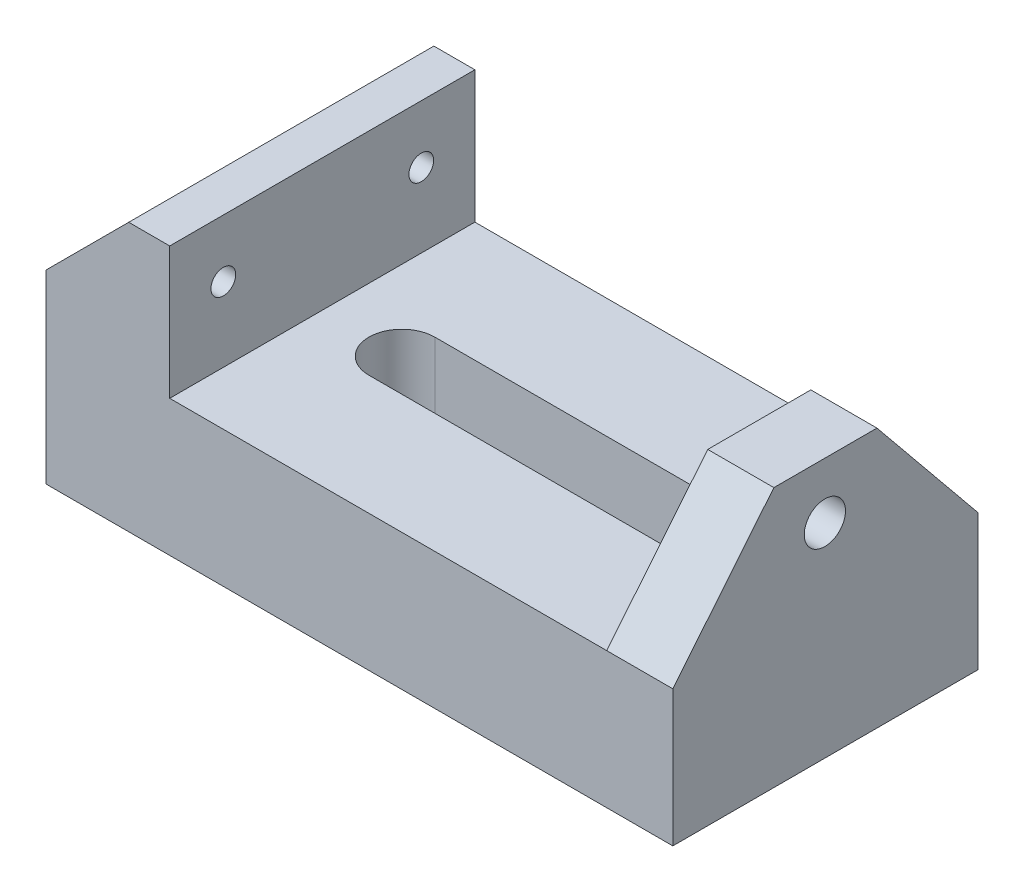
ISO-10303-21;
HEADER;
FILE_DESCRIPTION(('STEP AP214'),'2;1');
FILE_NAME('part.step','',(''),(''),'','','');
FILE_SCHEMA(('AUTOMOTIVE_DESIGN { 1 0 10303 214 1 1 1 1 }'));
ENDSEC;
DATA;
#1=APPLICATION_CONTEXT('core data for automotive mechanical design processes');
#2=APPLICATION_PROTOCOL_DEFINITION('international standard','automotive_design',2000,#1);
#3=PRODUCT_CONTEXT('',#1,'mechanical');
#4=PRODUCT('Part','Part','',(#3));
#5=PRODUCT_RELATED_PRODUCT_CATEGORY('part','',(#4));
#6=PRODUCT_DEFINITION_FORMATION('','',#4);
#7=PRODUCT_DEFINITION_CONTEXT('part definition',#1,'design');
#8=PRODUCT_DEFINITION('design','',#6,#7);
#9=PRODUCT_DEFINITION_SHAPE('','',#8);
#10=(LENGTH_UNIT() NAMED_UNIT(*) SI_UNIT(.MILLI.,.METRE.));
#11=(NAMED_UNIT(*) PLANE_ANGLE_UNIT() SI_UNIT($,.RADIAN.));
#12=(NAMED_UNIT(*) SI_UNIT($,.STERADIAN.) SOLID_ANGLE_UNIT());
#13=UNCERTAINTY_MEASURE_WITH_UNIT(LENGTH_MEASURE(1.E-05),#10,'distance_accuracy_value','');
#14=(GEOMETRIC_REPRESENTATION_CONTEXT(3) GLOBAL_UNCERTAINTY_ASSIGNED_CONTEXT((#13)) GLOBAL_UNIT_ASSIGNED_CONTEXT((#10,
#11,#12)) REPRESENTATION_CONTEXT('',''));
#15=CARTESIAN_POINT('',(0.,0.,0.));
#16=DIRECTION('',(0.,0.,1.));
#17=DIRECTION('',(1.,0.,0.));
#18=AXIS2_PLACEMENT_3D('',#15,#16,#17);
#19=CARTESIAN_POINT('',(-105.963302752294,0.,74.));
#20=DIRECTION('',(0.,-1.,0.));
#21=DIRECTION('',(0.,0.,-1.));
#22=AXIS2_PLACEMENT_3D('',#19,#20,#21);
#23=PLANE('',#22);
#24=DIRECTION('',(1.,0.,0.));
#25=VECTOR('',#24,1.);
#26=CARTESIAN_POINT('',(-86.6730770801467,0.,45.));
#27=LINE('',#26,#25);
#28=CARTESIAN_POINT('',(-86.6730770801467,0.,45.));
#29=VERTEX_POINT('',#28);
#30=CARTESIAN_POINT('',(-8.67307708014674,0.,45.));
#31=VERTEX_POINT('',#30);
#32=EDGE_CURVE('E277',#29,#31,#27,.T.);
#33=ORIENTED_EDGE('',*,*,#32,.F.);
#34=CARTESIAN_POINT('',(-86.6730770801467,0.,37.));
#35=DIRECTION('',(0.,1.,0.));
#36=DIRECTION('',(0.,0.,1.));
#37=AXIS2_PLACEMENT_3D('',#34,#35,#36);
#38=CIRCLE('',#37,8.);
#39=CARTESIAN_POINT('',(-86.6730770801467,0.,29.));
#40=VERTEX_POINT('',#39);
#41=EDGE_CURVE('E58',#40,#29,#38,.T.);
#42=ORIENTED_EDGE('',*,*,#41,.F.);
#43=DIRECTION('',(-1.,0.,0.));
#44=VECTOR('',#43,1.);
#45=CARTESIAN_POINT('',(-86.6730770801467,0.,29.));
#46=LINE('',#45,#44);
#47=CARTESIAN_POINT('',(-8.67307708014674,0.,29.));
#48=VERTEX_POINT('',#47);
#49=EDGE_CURVE('E267',#48,#40,#46,.T.);
#50=ORIENTED_EDGE('',*,*,#49,.F.);
#51=CARTESIAN_POINT('',(-8.67307708014674,0.,37.));
#52=DIRECTION('',(0.,1.,0.));
#53=DIRECTION('',(0.,0.,1.));
#54=AXIS2_PLACEMENT_3D('',#51,#52,#53);
#55=CIRCLE('',#54,8.);
#56=EDGE_CURVE('E274',#31,#48,#55,.T.);
#57=ORIENTED_EDGE('',*,*,#56,.F.);
#58=EDGE_LOOP('',(#33,#42,#50,#57));
#59=FACE_BOUND('',#58,.T.);
#60=DIRECTION('',(-1.,0.,0.));
#61=VECTOR('',#60,1.);
#62=CARTESIAN_POINT('',(-105.963302752294,0.,0.));
#63=LINE('',#62,#61);
#64=CARTESIAN_POINT('',(0.,0.,0.));
#65=VERTEX_POINT('',#64);
#66=CARTESIAN_POINT('',(-105.963302752294,0.,0.));
#67=VERTEX_POINT('',#66);
#68=EDGE_CURVE('E168',#65,#67,#63,.T.);
#69=ORIENTED_EDGE('',*,*,#68,.T.);
#70=DIRECTION('',(0.,0.,-1.));
#71=VECTOR('',#70,1.);
#72=CARTESIAN_POINT('',(-105.963302752294,0.,74.));
#73=LINE('',#72,#71);
#74=CARTESIAN_POINT('',(-105.963302752294,0.,74.));
#75=VERTEX_POINT('',#74);
#76=EDGE_CURVE('E196',#75,#67,#73,.T.);
#77=ORIENTED_EDGE('',*,*,#76,.F.);
#78=DIRECTION('',(-1.,0.,0.));
#79=VECTOR('',#78,1.);
#80=CARTESIAN_POINT('',(-105.963302752294,0.,74.));
#81=LINE('',#80,#79);
#82=CARTESIAN_POINT('',(0.,0.,74.));
#83=VERTEX_POINT('',#82);
#84=EDGE_CURVE('E183',#83,#75,#81,.T.);
#85=ORIENTED_EDGE('',*,*,#84,.F.);
#86=DIRECTION('',(0.,0.,-1.));
#87=VECTOR('',#86,1.);
#88=CARTESIAN_POINT('',(0.,0.,74.));
#89=LINE('',#88,#87);
#90=EDGE_CURVE('E159',#83,#65,#89,.T.);
#91=ORIENTED_EDGE('',*,*,#90,.T.);
#92=EDGE_LOOP('',(#69,#77,#85,#91));
#93=FACE_BOUND('',#92,.T.);
#94=ADVANCED_FACE('F35',(#59,#93),#23,.F.);
#95=CARTESIAN_POINT('',(-105.963302752294,32.,74.));
#96=DIRECTION('',(-1.,0.,0.));
#97=DIRECTION('',(0.,0.,1.));
#98=AXIS2_PLACEMENT_3D('',#95,#96,#97);
#99=PLANE('',#98);
#100=CARTESIAN_POINT('',(-105.963302752294,18.,61.));
#101=DIRECTION('',(1.,0.,0.));
#102=DIRECTION('',(0.,0.,-1.));
#103=AXIS2_PLACEMENT_3D('',#100,#101,#102);
#104=CIRCLE('',#103,3.);
#105=CARTESIAN_POINT('',(-105.963302752294,18.,58.));
#106=VERTEX_POINT('',#105);
#107=EDGE_CURVE('E204',#106,#106,#104,.T.);
#108=ORIENTED_EDGE('',*,*,#107,.F.);
#109=EDGE_LOOP('',(#108));
#110=FACE_BOUND('',#109,.T.);
#111=CARTESIAN_POINT('',(-105.963302752294,18.,13.));
#112=DIRECTION('',(1.,0.,0.));
#113=DIRECTION('',(0.,0.,-1.));
#114=AXIS2_PLACEMENT_3D('',#111,#112,#113);
#115=CIRCLE('',#114,3.);
#116=CARTESIAN_POINT('',(-105.963302752294,18.,10.));
#117=VERTEX_POINT('',#116);
#118=EDGE_CURVE('E252',#117,#117,#115,.T.);
#119=ORIENTED_EDGE('',*,*,#118,.F.);
#120=EDGE_LOOP('',(#119));
#121=FACE_BOUND('',#120,.T.);
#122=DIRECTION('',(0.,1.,0.));
#123=VECTOR('',#122,1.);
#124=CARTESIAN_POINT('',(-105.963302752294,32.,0.));
#125=LINE('',#124,#123);
#126=CARTESIAN_POINT('',(-105.963302752294,32.,0.));
#127=VERTEX_POINT('',#126);
#128=EDGE_CURVE('E170',#67,#127,#125,.T.);
#129=ORIENTED_EDGE('',*,*,#128,.T.);
#130=DIRECTION('',(0.,0.,-1.));
#131=VECTOR('',#130,1.);
#132=CARTESIAN_POINT('',(-105.963302752294,32.,74.));
#133=LINE('',#132,#131);
#134=CARTESIAN_POINT('',(-105.963302752294,32.,74.));
#135=VERTEX_POINT('',#134);
#136=EDGE_CURVE('E193',#135,#127,#133,.T.);
#137=ORIENTED_EDGE('',*,*,#136,.F.);
#138=DIRECTION('',(0.,1.,0.));
#139=VECTOR('',#138,1.);
#140=CARTESIAN_POINT('',(-105.963302752294,32.,74.));
#141=LINE('',#140,#139);
#142=EDGE_CURVE('E246',#75,#135,#141,.T.);
#143=ORIENTED_EDGE('',*,*,#142,.F.);
#144=ORIENTED_EDGE('',*,*,#76,.T.);
#145=EDGE_LOOP('',(#129,#137,#143,#144));
#146=FACE_BOUND('',#145,.T.);
#147=ADVANCED_FACE('F306',(#110,#121,#146),#99,.F.);
#148=CARTESIAN_POINT('',(-135.963302752294,32.,74.));
#149=DIRECTION('',(0.,-1.,0.));
#150=DIRECTION('',(0.,0.,-1.));
#151=AXIS2_PLACEMENT_3D('',#148,#149,#150);
#152=PLANE('',#151);
#153=DIRECTION('',(-1.,0.,0.));
#154=VECTOR('',#153,1.);
#155=CARTESIAN_POINT('',(-135.963302752294,32.,0.));
#156=LINE('',#155,#154);
#157=CARTESIAN_POINT('',(-115.906958265942,32.,0.));
#158=VERTEX_POINT('',#157);
#159=EDGE_CURVE('E174',#127,#158,#156,.T.);
#160=ORIENTED_EDGE('',*,*,#159,.T.);
#161=DIRECTION('',(0.,0.,1.));
#162=VECTOR('',#161,1.);
#163=CARTESIAN_POINT('',(-115.906958265942,32.,0.));
#164=LINE('',#163,#162);
#165=CARTESIAN_POINT('',(-115.906958265942,32.,74.));
#166=VERTEX_POINT('',#165);
#167=EDGE_CURVE('E238',#158,#166,#164,.T.);
#168=ORIENTED_EDGE('',*,*,#167,.T.);
#169=DIRECTION('',(-1.,0.,0.));
#170=VECTOR('',#169,1.);
#171=CARTESIAN_POINT('',(-115.963302752294,32.,74.));
#172=LINE('',#171,#170);
#173=EDGE_CURVE('E248',#135,#166,#172,.T.);
#174=ORIENTED_EDGE('',*,*,#173,.F.);
#175=ORIENTED_EDGE('',*,*,#136,.T.);
#176=EDGE_LOOP('',(#160,#168,#174,#175));
#177=FACE_BOUND('',#176,.T.);
#178=ADVANCED_FACE('F311',(#177),#152,.F.);
#179=CARTESIAN_POINT('',(-135.963302752294,-33.,74.));
#180=DIRECTION('',(1.,0.,0.));
#181=DIRECTION('',(0.,0.,-1.));
#182=AXIS2_PLACEMENT_3D('',#179,#180,#181);
#183=PLANE('',#182);
#184=CARTESIAN_POINT('',(-135.963302752294,-4.8642563903627,36.610721791007));
#185=DIRECTION('',(-1.,0.,0.));
#186=DIRECTION('',(0.,0.,1.));
#187=AXIS2_PLACEMENT_3D('',#184,#185,#186);
#188=CIRCLE('',#187,8.);
#189=CARTESIAN_POINT('',(-135.963302752294,-4.8642563903627,44.610721791007));
#190=VERTEX_POINT('',#189);
#191=EDGE_CURVE('E258',#190,#190,#188,.T.);
#192=ORIENTED_EDGE('',*,*,#191,.F.);
#193=EDGE_LOOP('',(#192));
#194=FACE_BOUND('',#193,.T.);
#195=DIRECTION('',(0.,-1.,0.));
#196=VECTOR('',#195,1.);
#197=CARTESIAN_POINT('',(-135.963302752294,18.,74.));
#198=LINE('',#197,#196);
#199=CARTESIAN_POINT('',(-135.963302752294,11.9436555136481,74.));
#200=VERTEX_POINT('',#199);
#201=CARTESIAN_POINT('',(-135.963302752294,-33.,74.));
#202=VERTEX_POINT('',#201);
#203=EDGE_CURVE('E164',#200,#202,#198,.T.);
#204=ORIENTED_EDGE('',*,*,#203,.F.);
#205=DIRECTION('',(0.,0.,1.));
#206=VECTOR('',#205,1.);
#207=CARTESIAN_POINT('',(-135.963302752294,11.9436555136481,0.));
#208=LINE('',#207,#206);
#209=CARTESIAN_POINT('',(-135.963302752294,11.9436555136481,0.));
#210=VERTEX_POINT('',#209);
#211=EDGE_CURVE('E171',#210,#200,#208,.T.);
#212=ORIENTED_EDGE('',*,*,#211,.F.);
#213=DIRECTION('',(0.,-1.,0.));
#214=VECTOR('',#213,1.);
#215=CARTESIAN_POINT('',(-135.963302752294,-33.,0.));
#216=LINE('',#215,#214);
#217=CARTESIAN_POINT('',(-135.963302752294,-33.,0.));
#218=VERTEX_POINT('',#217);
#219=EDGE_CURVE('E177',#210,#218,#216,.T.);
#220=ORIENTED_EDGE('',*,*,#219,.T.);
#221=DIRECTION('',(0.,0.,-1.));
#222=VECTOR('',#221,1.);
#223=CARTESIAN_POINT('',(-135.963302752294,-33.,74.));
#224=LINE('',#223,#222);
#225=EDGE_CURVE('E190',#202,#218,#224,.T.);
#226=ORIENTED_EDGE('',*,*,#225,.F.);
#227=EDGE_LOOP('',(#204,#212,#220,#226));
#228=FACE_BOUND('',#227,.T.);
#229=ADVANCED_FACE('F235',(#194,#228),#183,.F.);
#230=CARTESIAN_POINT('',(16.0366972477063,-33.,74.));
#231=DIRECTION('',(0.,1.,0.));
#232=DIRECTION('',(-1.,0.,0.));
#233=AXIS2_PLACEMENT_3D('',#230,#231,#232);
#234=PLANE('',#233);
#235=DIRECTION('',(-1.,0.,0.));
#236=VECTOR('',#235,1.);
#237=CARTESIAN_POINT('',(16.0366972477063,-33.,29.));
#238=LINE('',#237,#236);
#239=CARTESIAN_POINT('',(-8.67307708014674,-33.,29.));
#240=VERTEX_POINT('',#239);
#241=CARTESIAN_POINT('',(-86.6730770801467,-33.,29.));
#242=VERTEX_POINT('',#241);
#243=EDGE_CURVE('E213',#240,#242,#238,.T.);
#244=ORIENTED_EDGE('',*,*,#243,.T.);
#245=CARTESIAN_POINT('',(-86.6730770801467,-33.,37.));
#246=DIRECTION('',(0.,1.,0.));
#247=DIRECTION('',(-1.,0.,0.));
#248=AXIS2_PLACEMENT_3D('',#245,#246,#247);
#249=CIRCLE('',#248,8.);
#250=CARTESIAN_POINT('',(-86.6730770801467,-33.,45.));
#251=VERTEX_POINT('',#250);
#252=EDGE_CURVE('E216',#242,#251,#249,.T.);
#253=ORIENTED_EDGE('',*,*,#252,.T.);
#254=DIRECTION('',(1.,0.,0.));
#255=VECTOR('',#254,1.);
#256=CARTESIAN_POINT('',(16.0366972477063,-33.,45.));
#257=LINE('',#256,#255);
#258=CARTESIAN_POINT('',(-8.67307708014674,-33.,45.));
#259=VERTEX_POINT('',#258);
#260=EDGE_CURVE('E199',#251,#259,#257,.T.);
#261=ORIENTED_EDGE('',*,*,#260,.T.);
#262=CARTESIAN_POINT('',(-8.67307708014674,-33.,37.));
#263=DIRECTION('',(0.,1.,0.));
#264=DIRECTION('',(-1.,0.,0.));
#265=AXIS2_PLACEMENT_3D('',#262,#263,#264);
#266=CIRCLE('',#265,8.);
#267=EDGE_CURVE('E210',#259,#240,#266,.T.);
#268=ORIENTED_EDGE('',*,*,#267,.T.);
#269=EDGE_LOOP('',(#244,#253,#261,#268));
#270=FACE_BOUND('',#269,.T.);
#271=DIRECTION('',(1.,0.,0.));
#272=VECTOR('',#271,1.);
#273=CARTESIAN_POINT('',(16.0366972477063,-33.,0.));
#274=LINE('',#273,#272);
#275=CARTESIAN_POINT('',(16.0366972477063,-33.,0.));
#276=VERTEX_POINT('',#275);
#277=EDGE_CURVE('E179',#218,#276,#274,.T.);
#278=ORIENTED_EDGE('',*,*,#277,.T.);
#279=DIRECTION('',(0.,0.,-1.));
#280=VECTOR('',#279,1.);
#281=CARTESIAN_POINT('',(16.0366972477063,-33.,74.));
#282=LINE('',#281,#280);
#283=CARTESIAN_POINT('',(16.0366972477063,-33.,74.));
#284=VERTEX_POINT('',#283);
#285=EDGE_CURVE('E188',#284,#276,#282,.T.);
#286=ORIENTED_EDGE('',*,*,#285,.F.);
#287=DIRECTION('',(1.,0.,0.));
#288=VECTOR('',#287,1.);
#289=CARTESIAN_POINT('',(16.0366972477063,-33.,74.));
#290=LINE('',#289,#288);
#291=EDGE_CURVE('E157',#202,#284,#290,.T.);
#292=ORIENTED_EDGE('',*,*,#291,.F.);
#293=ORIENTED_EDGE('',*,*,#225,.T.);
#294=EDGE_LOOP('',(#278,#286,#292,#293));
#295=FACE_BOUND('',#294,.T.);
#296=ADVANCED_FACE('F227',(#270,#295),#234,.F.);
#297=CARTESIAN_POINT('',(16.0366972477063,30.,74.));
#298=DIRECTION('',(-1.,0.,0.));
#299=DIRECTION('',(0.,-1.,0.));
#300=AXIS2_PLACEMENT_3D('',#297,#298,#299);
#301=PLANE('',#300);
#302=CARTESIAN_POINT('',(16.0366972477063,16.44,37.1355677984919));
#303=DIRECTION('',(1.,0.,0.));
#304=DIRECTION('',(0.,1.,0.));
#305=AXIS2_PLACEMENT_3D('',#302,#303,#304);
#306=CIRCLE('',#305,5.);
#307=CARTESIAN_POINT('',(16.0366972477063,21.44,37.1355677984919));
#308=VERTEX_POINT('',#307);
#309=EDGE_CURVE('E287',#308,#308,#306,.T.);
#310=ORIENTED_EDGE('',*,*,#309,.F.);
#311=EDGE_LOOP('',(#310));
#312=FACE_BOUND('',#311,.T.);
#313=DIRECTION('',(0.,0.,-1.));
#314=VECTOR('',#313,1.);
#315=CARTESIAN_POINT('',(16.0366972477063,30.,74.));
#316=LINE('',#315,#314);
#317=CARTESIAN_POINT('',(16.0366972477063,30.,49.5));
#318=VERTEX_POINT('',#317);
#319=CARTESIAN_POINT('',(16.0366972477063,30.,24.5));
#320=VERTEX_POINT('',#319);
#321=EDGE_CURVE('E151',#318,#320,#316,.T.);
#322=ORIENTED_EDGE('',*,*,#321,.F.);
#323=DIRECTION('',(0.,0.774532127586641,-0.632534570862424));
#324=VECTOR('',#323,1.);
#325=CARTESIAN_POINT('',(16.0366972477063,0.,74.));
#326=LINE('',#325,#324);
#327=CARTESIAN_POINT('',(16.0366972477063,0.,74.));
#328=VERTEX_POINT('',#327);
#329=EDGE_CURVE('E137',#328,#318,#326,.T.);
#330=ORIENTED_EDGE('',*,*,#329,.F.);
#331=DIRECTION('',(0.,1.,0.));
#332=VECTOR('',#331,1.);
#333=CARTESIAN_POINT('',(16.0366972477063,30.,74.));
#334=LINE('',#333,#332);
#335=EDGE_CURVE('E149',#284,#328,#334,.T.);
#336=ORIENTED_EDGE('',*,*,#335,.F.);
#337=ORIENTED_EDGE('',*,*,#285,.T.);
#338=DIRECTION('',(0.,1.,0.));
#339=VECTOR('',#338,1.);
#340=CARTESIAN_POINT('',(16.0366972477063,30.,0.));
#341=LINE('',#340,#339);
#342=CARTESIAN_POINT('',(16.0366972477063,0.,0.));
#343=VERTEX_POINT('',#342);
#344=EDGE_CURVE('E181',#276,#343,#341,.T.);
#345=ORIENTED_EDGE('',*,*,#344,.T.);
#346=DIRECTION('',(0.,-0.774532127586641,-0.632534570862424));
#347=VECTOR('',#346,1.);
#348=CARTESIAN_POINT('',(16.0366972477063,30.,24.5));
#349=LINE('',#348,#347);
#350=EDGE_CURVE('E50',#320,#343,#349,.T.);
#351=ORIENTED_EDGE('',*,*,#350,.F.);
#352=EDGE_LOOP('',(#322,#330,#336,#337,#345,#351));
#353=FACE_BOUND('',#352,.T.);
#354=ADVANCED_FACE('F147',(#312,#353),#301,.F.);
#355=CARTESIAN_POINT('',(0.,30.,74.));
#356=DIRECTION('',(0.,-1.,0.));
#357=DIRECTION('',(0.,0.,-1.));
#358=AXIS2_PLACEMENT_3D('',#355,#356,#357);
#359=PLANE('',#358);
#360=DIRECTION('',(0.,0.,-1.));
#361=VECTOR('',#360,1.);
#362=CARTESIAN_POINT('',(0.,30.,74.));
#363=LINE('',#362,#361);
#364=CARTESIAN_POINT('',(0.,30.,49.5));
#365=VERTEX_POINT('',#364);
#366=CARTESIAN_POINT('',(0.,30.,24.5));
#367=VERTEX_POINT('',#366);
#368=EDGE_CURVE('E162',#365,#367,#363,.T.);
#369=ORIENTED_EDGE('',*,*,#368,.F.);
#370=DIRECTION('',(1.,0.,0.));
#371=VECTOR('',#370,1.);
#372=CARTESIAN_POINT('',(-5.96330275229375,30.,49.5));
#373=LINE('',#372,#371);
#374=EDGE_CURVE('E152',#365,#318,#373,.T.);
#375=ORIENTED_EDGE('',*,*,#374,.T.);
#376=ORIENTED_EDGE('',*,*,#321,.T.);
#377=DIRECTION('',(1.,0.,0.));
#378=VECTOR('',#377,1.);
#379=CARTESIAN_POINT('',(-5.96330275229375,30.,24.5));
#380=LINE('',#379,#378);
#381=EDGE_CURVE('E153',#367,#320,#380,.T.);
#382=ORIENTED_EDGE('',*,*,#381,.F.);
#383=EDGE_LOOP('',(#369,#375,#376,#382));
#384=FACE_BOUND('',#383,.T.);
#385=ADVANCED_FACE('F342',(#384),#359,.F.);
#386=CARTESIAN_POINT('',(0.,0.,74.));
#387=DIRECTION('',(1.,0.,0.));
#388=DIRECTION('',(0.,0.,-1.));
#389=AXIS2_PLACEMENT_3D('',#386,#387,#388);
#390=PLANE('',#389);
#391=CARTESIAN_POINT('',(0.,16.44,37.1355677984919));
#392=DIRECTION('',(1.,0.,0.));
#393=DIRECTION('',(0.,0.,-1.));
#394=AXIS2_PLACEMENT_3D('',#391,#392,#393);
#395=CIRCLE('',#394,5.);
#396=CARTESIAN_POINT('',(0.,16.44,32.1355677984919));
#397=VERTEX_POINT('',#396);
#398=EDGE_CURVE('E38',#397,#397,#395,.T.);
#399=ORIENTED_EDGE('',*,*,#398,.T.);
#400=EDGE_LOOP('',(#399));
#401=FACE_BOUND('',#400,.T.);
#402=ORIENTED_EDGE('',*,*,#90,.F.);
#403=DIRECTION('',(0.,0.774532127586641,-0.632534570862424));
#404=VECTOR('',#403,1.);
#405=CARTESIAN_POINT('',(0.,0.,74.));
#406=LINE('',#405,#404);
#407=EDGE_CURVE('E140',#83,#365,#406,.T.);
#408=ORIENTED_EDGE('',*,*,#407,.T.);
#409=ORIENTED_EDGE('',*,*,#368,.T.);
#410=DIRECTION('',(0.,-0.774532127586641,-0.632534570862424));
#411=VECTOR('',#410,1.);
#412=CARTESIAN_POINT('',(0.,36.253957673721,29.6073987668722));
#413=LINE('',#412,#411);
#414=EDGE_CURVE('E282',#367,#65,#413,.T.);
#415=ORIENTED_EDGE('',*,*,#414,.T.);
#416=EDGE_LOOP('',(#402,#408,#409,#415));
#417=FACE_BOUND('',#416,.T.);
#418=ADVANCED_FACE('F294',(#401,#417),#390,.F.);
#419=CARTESIAN_POINT('',(0.,0.,74.));
#420=DIRECTION('',(0.,0.,1.));
#421=DIRECTION('',(1.,0.,0.));
#422=AXIS2_PLACEMENT_3D('',#419,#420,#421);
#423=PLANE('',#422);
#424=DIRECTION('',(1.,0.,0.));
#425=VECTOR('',#424,1.);
#426=CARTESIAN_POINT('',(0.,0.,74.));
#427=LINE('',#426,#425);
#428=EDGE_CURVE('E11',#83,#328,#427,.T.);
#429=ORIENTED_EDGE('',*,*,#428,.F.);
#430=ORIENTED_EDGE('',*,*,#84,.T.);
#431=ORIENTED_EDGE('',*,*,#142,.T.);
#432=ORIENTED_EDGE('',*,*,#173,.T.);
#433=DIRECTION('',(0.707106781186546,0.707106781186549,0.));
#434=VECTOR('',#433,1.);
#435=CARTESIAN_POINT('',(-115.906958265942,32.,74.));
#436=LINE('',#435,#434);
#437=EDGE_CURVE('E207',#200,#166,#436,.T.);
#438=ORIENTED_EDGE('',*,*,#437,.F.);
#439=ORIENTED_EDGE('',*,*,#203,.T.);
#440=ORIENTED_EDGE('',*,*,#291,.T.);
#441=ORIENTED_EDGE('',*,*,#335,.T.);
#442=EDGE_LOOP('',(#429,#430,#431,#432,#438,#439,#440,#441));
#443=FACE_BOUND('',#442,.T.);
#444=ADVANCED_FACE('F155',(#443),#423,.T.);
#445=CARTESIAN_POINT('',(0.,0.,0.));
#446=DIRECTION('',(0.,0.,1.));
#447=DIRECTION('',(1.,0.,0.));
#448=AXIS2_PLACEMENT_3D('',#445,#446,#447);
#449=PLANE('',#448);
#450=ORIENTED_EDGE('',*,*,#68,.F.);
#451=DIRECTION('',(1.,0.,0.));
#452=VECTOR('',#451,1.);
#453=CARTESIAN_POINT('',(0.,0.,0.));
#454=LINE('',#453,#452);
#455=EDGE_CURVE('E43',#65,#343,#454,.T.);
#456=ORIENTED_EDGE('',*,*,#455,.T.);
#457=ORIENTED_EDGE('',*,*,#344,.F.);
#458=ORIENTED_EDGE('',*,*,#277,.F.);
#459=ORIENTED_EDGE('',*,*,#219,.F.);
#460=DIRECTION('',(0.707106781186546,0.707106781186549,0.));
#461=VECTOR('',#460,1.);
#462=CARTESIAN_POINT('',(-115.906958265942,32.,0.));
#463=LINE('',#462,#461);
#464=EDGE_CURVE('E231',#210,#158,#463,.T.);
#465=ORIENTED_EDGE('',*,*,#464,.T.);
#466=ORIENTED_EDGE('',*,*,#159,.F.);
#467=ORIENTED_EDGE('',*,*,#128,.F.);
#468=EDGE_LOOP('',(#450,#456,#457,#458,#459,#465,#466,#467));
#469=FACE_BOUND('',#468,.T.);
#470=ADVANCED_FACE('F222',(#469),#449,.F.);
#471=CARTESIAN_POINT('',(-115.906958265942,32.,0.));
#472=DIRECTION('',(0.707106781186549,-0.707106781186546,0.));
#473=DIRECTION('',(0.707106781186546,0.707106781186549,0.));
#474=AXIS2_PLACEMENT_3D('',#471,#472,#473);
#475=PLANE('',#474);
#476=CARTESIAN_POINT('',(-129.906958265942,18.,61.));
#477=DIRECTION('',(0.707106781186549,-0.707106781186546,0.));
#478=DIRECTION('',(0.707106781186546,0.707106781186549,0.));
#479=AXIS2_PLACEMENT_3D('',#476,#477,#478);
#480=ELLIPSE('',#479,4.24264068711928,3.);
#481=CARTESIAN_POINT('',(-126.906958265942,21.,61.));
#482=VERTEX_POINT('',#481);
#483=EDGE_CURVE('E203',#482,#482,#480,.T.);
#484=ORIENTED_EDGE('',*,*,#483,.T.);
#485=EDGE_LOOP('',(#484));
#486=FACE_BOUND('',#485,.T.);
#487=CARTESIAN_POINT('',(-129.906958265942,18.,13.));
#488=DIRECTION('',(0.707106781186549,-0.707106781186546,0.));
#489=DIRECTION('',(0.707106781186546,0.707106781186549,0.));
#490=AXIS2_PLACEMENT_3D('',#487,#488,#489);
#491=ELLIPSE('',#490,4.24264068711927,3.);
#492=CARTESIAN_POINT('',(-126.906958265942,21.,13.));
#493=VERTEX_POINT('',#492);
#494=EDGE_CURVE('E200',#493,#493,#491,.T.);
#495=ORIENTED_EDGE('',*,*,#494,.T.);
#496=EDGE_LOOP('',(#495));
#497=FACE_BOUND('',#496,.T.);
#498=ORIENTED_EDGE('',*,*,#437,.T.);
#499=ORIENTED_EDGE('',*,*,#167,.F.);
#500=ORIENTED_EDGE('',*,*,#464,.F.);
#501=ORIENTED_EDGE('',*,*,#211,.T.);
#502=EDGE_LOOP('',(#498,#499,#500,#501));
#503=FACE_BOUND('',#502,.T.);
#504=ADVANCED_FACE('F322',(#486,#497,#503),#475,.F.);
#505=CARTESIAN_POINT('',(-179.963302752294,18.,13.));
#506=DIRECTION('',(1.,0.,0.));
#507=DIRECTION('',(0.,0.,-1.));
#508=AXIS2_PLACEMENT_3D('',#505,#506,#507);
#509=CYLINDRICAL_SURFACE('',#508,3.);
#510=ORIENTED_EDGE('',*,*,#118,.T.);
#511=EDGE_LOOP('',(#510));
#512=FACE_BOUND('',#511,.T.);
#513=ORIENTED_EDGE('',*,*,#494,.F.);
#514=EDGE_LOOP('',(#513));
#515=FACE_BOUND('',#514,.T.);
#516=ADVANCED_FACE('F324',(#512,#515),#509,.F.);
#517=CARTESIAN_POINT('',(-179.963302752294,18.,61.));
#518=DIRECTION('',(1.,0.,0.));
#519=DIRECTION('',(0.,0.,-1.));
#520=AXIS2_PLACEMENT_3D('',#517,#518,#519);
#521=CYLINDRICAL_SURFACE('',#520,3.);
#522=ORIENTED_EDGE('',*,*,#107,.T.);
#523=EDGE_LOOP('',(#522));
#524=FACE_BOUND('',#523,.T.);
#525=ORIENTED_EDGE('',*,*,#483,.F.);
#526=EDGE_LOOP('',(#525));
#527=FACE_BOUND('',#526,.T.);
#528=ADVANCED_FACE('F331',(#524,#527),#521,.F.);
#529=CARTESIAN_POINT('',(-122.963302752294,-4.8642563903627,36.610721791007));
#530=DIRECTION('',(-1.,0.,0.));
#531=DIRECTION('',(0.,0.,1.));
#532=AXIS2_PLACEMENT_3D('',#529,#530,#531);
#533=CYLINDRICAL_SURFACE('',#532,8.);
#534=CARTESIAN_POINT('',(-122.963302752294,-4.8642563903627,36.610721791007));
#535=DIRECTION('',(-1.,0.,0.));
#536=DIRECTION('',(0.,0.,1.));
#537=AXIS2_PLACEMENT_3D('',#534,#535,#536);
#538=CIRCLE('',#537,8.);
#539=CARTESIAN_POINT('',(-122.963302752294,-4.8642563903627,44.610721791007));
#540=VERTEX_POINT('',#539);
#541=EDGE_CURVE('E255',#540,#540,#538,.T.);
#542=CARTESIAN_POINT('',(-122.963302752294,-4.8642563903627,44.610721791007));
#543=CARTESIAN_POINT('',(-123.09871941896,-4.8642563903627,44.610721791007));
#544=CARTESIAN_POINT('',(-123.234136085627,-4.8642563903627,44.610721791007));
#545=CARTESIAN_POINT('',(-123.50496941896,-4.8642563903627,44.610721791007));
#546=CARTESIAN_POINT('',(-123.640386085627,-4.8642563903627,44.610721791007));
#547=CARTESIAN_POINT('',(-123.91121941896,-4.8642563903627,44.610721791007));
#548=CARTESIAN_POINT('',(-124.046636085627,-4.8642563903627,44.610721791007));
#549=CARTESIAN_POINT('',(-124.31746941896,-4.8642563903627,44.610721791007));
#550=CARTESIAN_POINT('',(-124.452886085627,-4.8642563903627,44.610721791007));
#551=CARTESIAN_POINT('',(-124.72371941896,-4.8642563903627,44.610721791007));
#552=CARTESIAN_POINT('',(-124.859136085627,-4.8642563903627,44.610721791007));
#553=CARTESIAN_POINT('',(-125.12996941896,-4.8642563903627,44.610721791007));
#554=CARTESIAN_POINT('',(-125.265386085627,-4.8642563903627,44.610721791007));
#555=CARTESIAN_POINT('',(-125.53621941896,-4.8642563903627,44.610721791007));
#556=CARTESIAN_POINT('',(-125.671636085627,-4.8642563903627,44.610721791007));
#557=CARTESIAN_POINT('',(-125.94246941896,-4.8642563903627,44.610721791007));
#558=CARTESIAN_POINT('',(-126.077886085627,-4.8642563903627,44.610721791007));
#559=CARTESIAN_POINT('',(-126.34871941896,-4.8642563903627,44.610721791007));
#560=CARTESIAN_POINT('',(-126.484136085627,-4.8642563903627,44.610721791007));
#561=CARTESIAN_POINT('',(-126.75496941896,-4.8642563903627,44.610721791007));
#562=CARTESIAN_POINT('',(-126.890386085627,-4.8642563903627,44.610721791007));
#563=CARTESIAN_POINT('',(-127.16121941896,-4.8642563903627,44.610721791007));
#564=CARTESIAN_POINT('',(-127.296636085627,-4.8642563903627,44.610721791007));
#565=CARTESIAN_POINT('',(-127.56746941896,-4.8642563903627,44.610721791007));
#566=CARTESIAN_POINT('',(-127.702886085627,-4.8642563903627,44.610721791007));
#567=CARTESIAN_POINT('',(-127.97371941896,-4.8642563903627,44.610721791007));
#568=CARTESIAN_POINT('',(-128.109136085627,-4.8642563903627,44.610721791007));
#569=CARTESIAN_POINT('',(-128.37996941896,-4.8642563903627,44.610721791007));
#570=CARTESIAN_POINT('',(-128.515386085627,-4.8642563903627,44.610721791007));
#571=CARTESIAN_POINT('',(-128.78621941896,-4.8642563903627,44.610721791007));
#572=CARTESIAN_POINT('',(-128.921636085627,-4.8642563903627,44.610721791007));
#573=CARTESIAN_POINT('',(-129.19246941896,-4.8642563903627,44.610721791007));
#574=CARTESIAN_POINT('',(-129.327886085627,-4.8642563903627,44.610721791007));
#575=CARTESIAN_POINT('',(-129.59871941896,-4.8642563903627,44.610721791007));
#576=CARTESIAN_POINT('',(-129.734136085627,-4.8642563903627,44.610721791007));
#577=CARTESIAN_POINT('',(-130.00496941896,-4.8642563903627,44.610721791007));
#578=CARTESIAN_POINT('',(-130.140386085627,-4.8642563903627,44.610721791007));
#579=CARTESIAN_POINT('',(-130.41121941896,-4.8642563903627,44.610721791007));
#580=CARTESIAN_POINT('',(-130.546636085627,-4.8642563903627,44.610721791007));
#581=CARTESIAN_POINT('',(-130.81746941896,-4.8642563903627,44.610721791007));
#582=CARTESIAN_POINT('',(-130.952886085627,-4.8642563903627,44.610721791007));
#583=CARTESIAN_POINT('',(-131.22371941896,-4.8642563903627,44.610721791007));
#584=CARTESIAN_POINT('',(-131.359136085627,-4.8642563903627,44.610721791007));
#585=CARTESIAN_POINT('',(-131.62996941896,-4.8642563903627,44.610721791007));
#586=CARTESIAN_POINT('',(-131.765386085627,-4.8642563903627,44.610721791007));
#587=CARTESIAN_POINT('',(-132.03621941896,-4.8642563903627,44.610721791007));
#588=CARTESIAN_POINT('',(-132.171636085627,-4.8642563903627,44.610721791007));
#589=CARTESIAN_POINT('',(-132.44246941896,-4.8642563903627,44.610721791007));
#590=CARTESIAN_POINT('',(-132.577886085627,-4.8642563903627,44.610721791007));
#591=CARTESIAN_POINT('',(-132.84871941896,-4.8642563903627,44.610721791007));
#592=CARTESIAN_POINT('',(-132.984136085627,-4.8642563903627,44.610721791007));
#593=CARTESIAN_POINT('',(-133.25496941896,-4.8642563903627,44.610721791007));
#594=CARTESIAN_POINT('',(-133.390386085627,-4.8642563903627,44.610721791007));
#595=CARTESIAN_POINT('',(-133.66121941896,-4.8642563903627,44.610721791007));
#596=CARTESIAN_POINT('',(-133.796636085627,-4.8642563903627,44.610721791007));
#597=CARTESIAN_POINT('',(-134.06746941896,-4.8642563903627,44.610721791007));
#598=CARTESIAN_POINT('',(-134.202886085627,-4.8642563903627,44.610721791007));
#599=CARTESIAN_POINT('',(-134.47371941896,-4.8642563903627,44.610721791007));
#600=CARTESIAN_POINT('',(-134.609136085627,-4.8642563903627,44.610721791007));
#601=CARTESIAN_POINT('',(-134.87996941896,-4.8642563903627,44.610721791007));
#602=CARTESIAN_POINT('',(-135.015386085627,-4.8642563903627,44.610721791007));
#603=CARTESIAN_POINT('',(-135.28621941896,-4.8642563903627,44.610721791007));
#604=CARTESIAN_POINT('',(-135.421636085627,-4.8642563903627,44.610721791007));
#605=CARTESIAN_POINT('',(-135.69246941896,-4.8642563903627,44.610721791007));
#606=CARTESIAN_POINT('',(-135.827886085627,-4.8642563903627,44.610721791007));
#607=CARTESIAN_POINT('',(-135.963302752294,-4.8642563903627,44.610721791007));
#608=B_SPLINE_CURVE_WITH_KNOTS('',3,(#542,#543,#544,#545,#546,#547,#548,#549,#550,#551,#552,
#553,#554,#555,#556,#557,#558,#559,#560,#561,#562,#563,#564,#565,#566,#567,#568,#569,#570,#571,
#572,#573,#574,#575,#576,#577,#578,#579,#580,#581,#582,#583,#584,#585,#586,#587,#588,#589,#590,
#591,#592,#593,#594,#595,#596,#597,#598,#599,#600,#601,#602,#603,#604,#605,#606,#607),
.UNSPECIFIED.,.F.,.F.,(4,2,2,2,2,2,2,2,2,2,2,2,2,2,2,2,2,2,2,2,2,2,2,2,2,2,2,2,2,2,2,2,4),(0.,
0.406250000000011,0.812500000000008,1.21875,1.625,2.03125,2.43750000000001,2.84375000000001,
3.25,3.65625,4.0625,4.46874999999999,4.87499999999999,5.28125000000002,5.68750000000001,
6.09375000000001,6.50000000000001,6.90625,7.3125,7.71875,8.12499999999999,8.53124999999999,
8.93749999999999,9.34374999999998,9.75000000000001,10.15625,10.5625,10.96875,11.375,11.78125,
12.1875,12.59375,13.),.UNSPECIFIED.);
#609=EDGE_CURVE('BSEAM449',#540,#190,#608,.T.);
#610=ORIENTED_EDGE('',*,*,#541,.F.);
#611=ORIENTED_EDGE('',*,*,#191,.T.);
#612=ORIENTED_EDGE('',*,*,#609,.T.);
#613=ORIENTED_EDGE('',*,*,#609,.F.);
#614=EDGE_LOOP('',(#610,#612,#611,#613));
#615=FACE_BOUND('',#614,.T.);
#616=ADVANCED_FACE('F449',(#615),#533,.F.);
#617=CARTESIAN_POINT('',(-122.963302752294,-4.8642563903627,36.610721791007));
#618=DIRECTION('',(-1.,0.,0.));
#619=DIRECTION('',(0.,0.,1.));
#620=AXIS2_PLACEMENT_3D('',#617,#618,#619);
#621=PLANE('',#620);
#622=ORIENTED_EDGE('',*,*,#541,.T.);
#623=EDGE_LOOP('',(#622));
#624=FACE_BOUND('',#623,.T.);
#625=ADVANCED_FACE('F443',(#624),#621,.T.);
#626=CARTESIAN_POINT('',(-86.6730770801467,-90.,37.));
#627=DIRECTION('',(0.,1.,0.));
#628=DIRECTION('',(0.,0.,1.));
#629=AXIS2_PLACEMENT_3D('',#626,#627,#628);
#630=CYLINDRICAL_SURFACE('',#629,8.);
#631=DIRECTION('',(0.,1.,0.));
#632=VECTOR('',#631,1.);
#633=CARTESIAN_POINT('',(-86.6730770801467,-90.,29.));
#634=LINE('',#633,#632);
#635=EDGE_CURVE('E261',#242,#40,#634,.T.);
#636=ORIENTED_EDGE('',*,*,#635,.T.);
#637=ORIENTED_EDGE('',*,*,#41,.T.);
#638=DIRECTION('',(0.,1.,0.));
#639=VECTOR('',#638,1.);
#640=CARTESIAN_POINT('',(-86.6730770801467,-90.,45.));
#641=LINE('',#640,#639);
#642=EDGE_CURVE('E264',#251,#29,#641,.T.);
#643=ORIENTED_EDGE('',*,*,#642,.F.);
#644=ORIENTED_EDGE('',*,*,#252,.F.);
#645=EDGE_LOOP('',(#636,#637,#643,#644));
#646=FACE_BOUND('',#645,.T.);
#647=ADVANCED_FACE('F436',(#646),#630,.F.);
#648=CARTESIAN_POINT('',(-86.6730770801467,-90.,29.));
#649=DIRECTION('',(0.,0.,-1.));
#650=DIRECTION('',(-1.,0.,0.));
#651=AXIS2_PLACEMENT_3D('',#648,#649,#650);
#652=PLANE('',#651);
#653=DIRECTION('',(0.,1.,0.));
#654=VECTOR('',#653,1.);
#655=CARTESIAN_POINT('',(-8.67307708014674,-90.,29.));
#656=LINE('',#655,#654);
#657=EDGE_CURVE('E269',#240,#48,#656,.T.);
#658=ORIENTED_EDGE('',*,*,#657,.T.);
#659=ORIENTED_EDGE('',*,*,#49,.T.);
#660=ORIENTED_EDGE('',*,*,#635,.F.);
#661=ORIENTED_EDGE('',*,*,#243,.F.);
#662=EDGE_LOOP('',(#658,#659,#660,#661));
#663=FACE_BOUND('',#662,.T.);
#664=ADVANCED_FACE('F428',(#663),#652,.F.);
#665=CARTESIAN_POINT('',(-8.67307708014674,-90.,37.));
#666=DIRECTION('',(0.,1.,0.));
#667=DIRECTION('',(0.,0.,1.));
#668=AXIS2_PLACEMENT_3D('',#665,#666,#667);
#669=CYLINDRICAL_SURFACE('',#668,8.);
#670=DIRECTION('',(0.,1.,0.));
#671=VECTOR('',#670,1.);
#672=CARTESIAN_POINT('',(-8.67307708014674,-90.,45.));
#673=LINE('',#672,#671);
#674=EDGE_CURVE('E266',#259,#31,#673,.T.);
#675=ORIENTED_EDGE('',*,*,#674,.T.);
#676=ORIENTED_EDGE('',*,*,#56,.T.);
#677=ORIENTED_EDGE('',*,*,#657,.F.);
#678=ORIENTED_EDGE('',*,*,#267,.F.);
#679=EDGE_LOOP('',(#675,#676,#677,#678));
#680=FACE_BOUND('',#679,.T.);
#681=ADVANCED_FACE('F421',(#680),#669,.F.);
#682=CARTESIAN_POINT('',(-86.6730770801467,-90.,45.));
#683=DIRECTION('',(0.,0.,1.));
#684=DIRECTION('',(1.,0.,0.));
#685=AXIS2_PLACEMENT_3D('',#682,#683,#684);
#686=PLANE('',#685);
#687=ORIENTED_EDGE('',*,*,#642,.T.);
#688=ORIENTED_EDGE('',*,*,#32,.T.);
#689=ORIENTED_EDGE('',*,*,#674,.F.);
#690=ORIENTED_EDGE('',*,*,#260,.F.);
#691=EDGE_LOOP('',(#687,#688,#689,#690));
#692=FACE_BOUND('',#691,.T.);
#693=ADVANCED_FACE('F402',(#692),#686,.F.);
#694=CARTESIAN_POINT('',(-5.96330275229375,30.,24.5));
#695=DIRECTION('',(0.,-0.632534570862424,0.774532127586641));
#696=DIRECTION('',(0.,-0.774532127586641,-0.632534570862424));
#697=AXIS2_PLACEMENT_3D('',#694,#695,#696);
#698=PLANE('',#697);
#699=ORIENTED_EDGE('',*,*,#381,.T.);
#700=ORIENTED_EDGE('',*,*,#350,.T.);
#701=ORIENTED_EDGE('',*,*,#455,.F.);
#702=ORIENTED_EDGE('',*,*,#414,.F.);
#703=EDGE_LOOP('',(#699,#700,#701,#702));
#704=FACE_BOUND('',#703,.T.);
#705=ADVANCED_FACE('F303',(#704),#698,.F.);
#706=CARTESIAN_POINT('',(-5.96330275229375,0.,74.));
#707=DIRECTION('',(0.,-0.632534570862424,-0.774532127586641));
#708=DIRECTION('',(0.,0.774532127586641,-0.632534570862424));
#709=AXIS2_PLACEMENT_3D('',#706,#707,#708);
#710=PLANE('',#709);
#711=ORIENTED_EDGE('',*,*,#428,.T.);
#712=ORIENTED_EDGE('',*,*,#329,.T.);
#713=ORIENTED_EDGE('',*,*,#374,.F.);
#714=ORIENTED_EDGE('',*,*,#407,.F.);
#715=EDGE_LOOP('',(#711,#712,#713,#714));
#716=FACE_BOUND('',#715,.T.);
#717=ADVANCED_FACE('F136',(#716),#710,.F.);
#718=CARTESIAN_POINT('',(-5.96330275229375,16.44,37.1355677984919));
#719=DIRECTION('',(1.,0.,0.));
#720=DIRECTION('',(0.,1.,0.));
#721=AXIS2_PLACEMENT_3D('',#718,#719,#720);
#722=CYLINDRICAL_SURFACE('',#721,5.);
#723=ORIENTED_EDGE('',*,*,#309,.T.);
#724=EDGE_LOOP('',(#723));
#725=FACE_BOUND('',#724,.T.);
#726=ORIENTED_EDGE('',*,*,#398,.F.);
#727=EDGE_LOOP('',(#726));
#728=FACE_BOUND('',#727,.T.);
#729=ADVANCED_FACE('F297',(#725,#728),#722,.F.);
#730=CLOSED_SHELL('',(#94,#147,#178,#229,#296,#354,#385,#418,#444,#470,#504,#516,#528,#616,#625,
#647,#664,#681,#693,#705,#717,#729));
#731=MANIFOLD_SOLID_BREP('B2',#730);
#732=ADVANCED_BREP_SHAPE_REPRESENTATION('',(#18,#731),#14);
#733=SHAPE_DEFINITION_REPRESENTATION(#9,#732);
ENDSEC;
END-ISO-10303-21;
